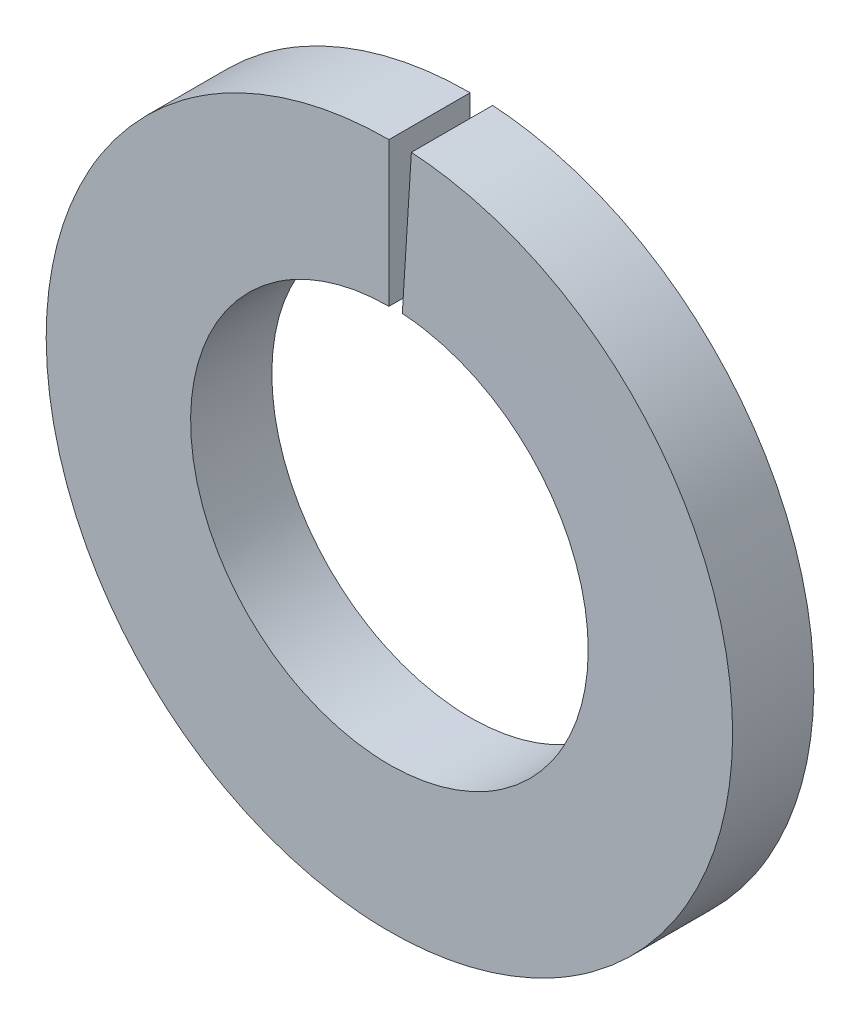
ISO-10303-21;
HEADER;
FILE_DESCRIPTION(('STEP AP214'),'2;1');
FILE_NAME('part.step','',(''),(''),'','','');
FILE_SCHEMA(('AUTOMOTIVE_DESIGN { 1 0 10303 214 1 1 1 1 }'));
ENDSEC;
DATA;
#1=APPLICATION_CONTEXT('core data for automotive mechanical design processes');
#2=APPLICATION_PROTOCOL_DEFINITION('international standard','automotive_design',2000,#1);
#3=PRODUCT_CONTEXT('',#1,'mechanical');
#4=PRODUCT('Part','Part','',(#3));
#5=PRODUCT_RELATED_PRODUCT_CATEGORY('part','',(#4));
#6=PRODUCT_DEFINITION_FORMATION('','',#4);
#7=PRODUCT_DEFINITION_CONTEXT('part definition',#1,'design');
#8=PRODUCT_DEFINITION('design','',#6,#7);
#9=PRODUCT_DEFINITION_SHAPE('','',#8);
#10=(LENGTH_UNIT() NAMED_UNIT(*) SI_UNIT(.MILLI.,.METRE.));
#11=(NAMED_UNIT(*) PLANE_ANGLE_UNIT() SI_UNIT($,.RADIAN.));
#12=(NAMED_UNIT(*) SI_UNIT($,.STERADIAN.) SOLID_ANGLE_UNIT());
#13=UNCERTAINTY_MEASURE_WITH_UNIT(LENGTH_MEASURE(1.E-05),#10,'distance_accuracy_value','');
#14=(GEOMETRIC_REPRESENTATION_CONTEXT(3) GLOBAL_UNCERTAINTY_ASSIGNED_CONTEXT((#13)) GLOBAL_UNIT_ASSIGNED_CONTEXT((#10,
#11,#12)) REPRESENTATION_CONTEXT('',''));
#15=CARTESIAN_POINT('',(0.,0.,0.));
#16=DIRECTION('',(0.,0.,1.));
#17=DIRECTION('',(1.,0.,0.));
#18=AXIS2_PLACEMENT_3D('',#15,#16,#17);
#19=CARTESIAN_POINT('',(0.,0.,0.));
#20=DIRECTION('',(1.,0.,0.));
#21=DIRECTION('',(0.,0.,-1.));
#22=AXIS2_PLACEMENT_3D('',#19,#20,#21);
#23=PLANE('',#22);
#24=DIRECTION('',(0.,0.,1.));
#25=VECTOR('',#24,1.);
#26=CARTESIAN_POINT('',(0.,3.8,0.));
#27=LINE('',#26,#25);
#28=CARTESIAN_POINT('',(0.,3.8,0.));
#29=VERTEX_POINT('',#28);
#30=CARTESIAN_POINT('',(0.,3.8,0.9));
#31=VERTEX_POINT('',#30);
#32=EDGE_CURVE('E88',#29,#31,#27,.T.);
#33=ORIENTED_EDGE('',*,*,#32,.T.);
#34=DIRECTION('',(0.,-1.,0.));
#35=VECTOR('',#34,1.);
#36=CARTESIAN_POINT('',(0.,3.8,0.9));
#37=LINE('',#36,#35);
#38=CARTESIAN_POINT('',(0.,2.2,0.9));
#39=VERTEX_POINT('',#38);
#40=EDGE_CURVE('E81',#31,#39,#37,.T.);
#41=ORIENTED_EDGE('',*,*,#40,.T.);
#42=DIRECTION('',(0.,0.,-1.));
#43=VECTOR('',#42,1.);
#44=CARTESIAN_POINT('',(0.,2.2,0.));
#45=LINE('',#44,#43);
#46=CARTESIAN_POINT('',(0.,2.2,0.));
#47=VERTEX_POINT('',#46);
#48=EDGE_CURVE('E76',#39,#47,#45,.T.);
#49=ORIENTED_EDGE('',*,*,#48,.T.);
#50=DIRECTION('',(0.,1.,0.));
#51=VECTOR('',#50,1.);
#52=CARTESIAN_POINT('',(0.,3.8,0.));
#53=LINE('',#52,#51);
#54=EDGE_CURVE('E71',#47,#29,#53,.T.);
#55=ORIENTED_EDGE('',*,*,#54,.T.);
#56=EDGE_LOOP('',(#33,#41,#49,#55));
#57=FACE_BOUND('',#56,.T.);
#58=ADVANCED_FACE('F36',(#57),#23,.T.);
#59=CARTESIAN_POINT('',(0.,0.,-0.01));
#60=DIRECTION('',(0.998026728428272,-0.0627905195292991,0.));
#61=DIRECTION('',(0.,0.,-1.));
#62=AXIS2_PLACEMENT_3D('',#59,#60,#61);
#63=PLANE('',#62);
#64=DIRECTION('',(0.,0.,1.));
#65=VECTOR('',#64,1.);
#66=CARTESIAN_POINT('',(0.238603974211337,3.79250156802744,-0.01));
#67=LINE('',#66,#65);
#68=CARTESIAN_POINT('',(0.238603974211337,3.79250156802744,-0.01));
#69=VERTEX_POINT('',#68);
#70=CARTESIAN_POINT('',(0.238603974211306,3.79250156802744,0.89));
#71=VERTEX_POINT('',#70);
#72=EDGE_CURVE('E96',#69,#71,#67,.T.);
#73=ORIENTED_EDGE('',*,*,#72,.F.);
#74=DIRECTION('',(0.0627905195292991,0.998026728428272,0.));
#75=VECTOR('',#74,1.);
#76=CARTESIAN_POINT('',(0.238603974211337,3.79250156802744,-0.01));
#77=LINE('',#76,#75);
#78=CARTESIAN_POINT('',(0.138139142964458,2.1956588025422,-0.01));
#79=VERTEX_POINT('',#78);
#80=EDGE_CURVE('E11',#79,#69,#77,.T.);
#81=ORIENTED_EDGE('',*,*,#80,.F.);
#82=DIRECTION('',(0.,0.,-1.));
#83=VECTOR('',#82,1.);
#84=CARTESIAN_POINT('',(0.138139142964458,2.1956588025422,-0.01));
#85=LINE('',#84,#83);
#86=CARTESIAN_POINT('',(0.13813914296444,2.1956588025422,0.89));
#87=VERTEX_POINT('',#86);
#88=EDGE_CURVE('E50',#87,#79,#85,.T.);
#89=ORIENTED_EDGE('',*,*,#88,.F.);
#90=DIRECTION('',(-0.0627905195292991,-0.998026728428272,0.));
#91=VECTOR('',#90,1.);
#92=CARTESIAN_POINT('',(0.238603974211337,3.79250156802744,0.89));
#93=LINE('',#92,#91);
#94=EDGE_CURVE('E59',#71,#87,#93,.T.);
#95=ORIENTED_EDGE('',*,*,#94,.F.);
#96=EDGE_LOOP('',(#73,#81,#89,#95));
#97=FACE_BOUND('',#96,.T.);
#98=ADVANCED_FACE('F142',(#97),#63,.F.);
#99=CARTESIAN_POINT('',(0.,0.,0.));
#100=DIRECTION('',(0.,0.,-1.));
#101=DIRECTION('',(-1.,0.,0.));
#102=AXIS2_PLACEMENT_3D('',#99,#100,#101);
#103=CYLINDRICAL_SURFACE('',#102,3.8);
#104=CARTESIAN_POINT('',(0.,3.8,0.9));
#105=CARTESIAN_POINT('',(-2.16748173275853,3.8,0.899166666666666));
#106=CARTESIAN_POINT('',(-3.270819702615,1.9343573798514,0.898333333333333));
#107=CARTESIAN_POINT('',(-4.37415767247146,0.0687147597027889,0.8975));
#108=CARTESIAN_POINT('',(-3.32996538416666,-1.83066396158655,0.896666666666666));
#109=CARTESIAN_POINT('',(-2.28577309586187,-3.73004268287589,0.895833333333333));
#110=CARTESIAN_POINT('',(-0.11936088449683,-3.79812492938978,0.895));
#111=CARTESIAN_POINT('',(2.04705132686821,-3.86620717590367,0.894166666666666));
#112=CARTESIAN_POINT('',(3.2084461169077,-2.03614182092012,0.893333333333333));
#113=CARTESIAN_POINT('',(4.36984090694719,-0.206076465936575,0.8925));
#114=CARTESIAN_POINT('',(3.38582479191576,1.72516389901036,0.891666666666666));
#115=CARTESIAN_POINT('',(2.40180867688432,3.6564042639573,0.890833333333333));
#116=CARTESIAN_POINT('',(0.238603974211276,3.79250156802744,0.89));
#117=(BOUNDED_CURVE() B_SPLINE_CURVE(2,(#104,#105,#106,#107,#108,#109,#110,#111,#112,#113,#114,
#115,#116),.UNSPECIFIED.,.F.,.F.) B_SPLINE_CURVE_WITH_KNOTS((3,2,2,2,2,2,3),(0.,
0.166666666666667,0.333333333333333,0.5,0.666666666666667,0.833333333333333,1.),
.UNSPECIFIED.) CURVE() GEOMETRIC_REPRESENTATION_ITEM() RATIONAL_B_SPLINE_CURVE((1.,
0.86863151443819,1.,0.86863151443819,1.,0.86863151443819,1.,0.86863151443819,1.,
0.86863151443819,1.,0.86863151443819,1.)) REPRESENTATION_ITEM(''));
#118=EDGE_CURVE('E91',#31,#71,#117,.T.);
#119=ORIENTED_EDGE('',*,*,#118,.F.);
#120=ORIENTED_EDGE('',*,*,#32,.F.);
#121=CARTESIAN_POINT('',(0.,3.8,0.));
#122=CARTESIAN_POINT('',(-2.16748173275853,3.8,-0.000833333333333333));
#123=CARTESIAN_POINT('',(-3.27081970261499,1.9343573798514,-0.00166666666666667));
#124=CARTESIAN_POINT('',(-4.37415767247146,0.0687147597028063,-0.0025));
#125=CARTESIAN_POINT('',(-3.32996538416667,-1.83066396158653,-0.00333333333333333));
#126=CARTESIAN_POINT('',(-2.28577309586189,-3.73004268287588,-0.00416666666666667));
#127=CARTESIAN_POINT('',(-0.11936088449686,-3.79812492938978,-0.005));
#128=CARTESIAN_POINT('',(2.04705132686817,-3.86620717590369,-0.00583333333333333));
#129=CARTESIAN_POINT('',(3.20844611690768,-2.03614182092016,-0.00666666666666667));
#130=CARTESIAN_POINT('',(4.36984090694718,-0.206076465936626,-0.0075));
#131=CARTESIAN_POINT('',(3.38582479191578,1.72516389901032,-0.00833333333333333));
#132=CARTESIAN_POINT('',(2.40180867688437,3.65640426395726,-0.00916666666666667));
#133=CARTESIAN_POINT('',(0.238603974211337,3.79250156802744,-0.01));
#134=(BOUNDED_CURVE() B_SPLINE_CURVE(2,(#121,#122,#123,#124,#125,#126,#127,#128,#129,#130,#131,
#132,#133),.UNSPECIFIED.,.F.,.F.) B_SPLINE_CURVE_WITH_KNOTS((3,2,2,2,2,2,3),(0.,
0.166666666666667,0.333333333333333,0.5,0.666666666666667,0.833333333333333,1.),
.UNSPECIFIED.) CURVE() GEOMETRIC_REPRESENTATION_ITEM() RATIONAL_B_SPLINE_CURVE((1.,
0.868631514438191,1.,0.868631514438191,1.,0.868631514438191,1.,0.868631514438191,1.,
0.868631514438191,1.,0.868631514438191,1.)) REPRESENTATION_ITEM(''));
#135=EDGE_CURVE('E90',#29,#69,#134,.T.);
#136=ORIENTED_EDGE('',*,*,#135,.T.);
#137=ORIENTED_EDGE('',*,*,#72,.T.);
#138=EDGE_LOOP('',(#119,#120,#136,#137));
#139=FACE_BOUND('',#138,.T.);
#140=ADVANCED_FACE('F89',(#139),#103,.T.);
#141=CARTESIAN_POINT('',(0.,3.8,0.9));
#142=CARTESIAN_POINT('',(-2.16748173275853,3.8,0.899166666666666));
#143=CARTESIAN_POINT('',(-3.270819702615,1.9343573798514,0.898333333333333));
#144=CARTESIAN_POINT('',(-4.37415767247146,0.0687147597027889,0.8975));
#145=CARTESIAN_POINT('',(-3.32996538416666,-1.83066396158655,0.896666666666666));
#146=CARTESIAN_POINT('',(-2.28577309586187,-3.73004268287589,0.895833333333333));
#147=CARTESIAN_POINT('',(-0.11936088449683,-3.79812492938978,0.895));
#148=CARTESIAN_POINT('',(2.04705132686821,-3.86620717590367,0.894166666666666));
#149=CARTESIAN_POINT('',(3.2084461169077,-2.03614182092012,0.893333333333333));
#150=CARTESIAN_POINT('',(4.36984090694719,-0.206076465936575,0.8925));
#151=CARTESIAN_POINT('',(3.38582479191576,1.72516389901036,0.891666666666666));
#152=CARTESIAN_POINT('',(2.40180867688432,3.6564042639573,0.890833333333333));
#153=CARTESIAN_POINT('',(0.238603974211276,3.79250156802744,0.89));
#154=CARTESIAN_POINT('',(0.,2.2,0.9));
#155=CARTESIAN_POINT('',(-1.25485784528126,2.2,0.899166666666666));
#156=CARTESIAN_POINT('',(-1.89363245940868,1.11989111465081,0.898333333333333));
#157=CARTESIAN_POINT('',(-2.53240707353611,0.0397822293016146,0.8975));
#158=CARTESIAN_POINT('',(-1.92787469609649,-1.05985808302379,0.896666666666666));
#159=CARTESIAN_POINT('',(-1.32334231865687,-2.1594983953492,0.895833333333333));
#160=CARTESIAN_POINT('',(-0.0691036699718489,-2.19891443280461,0.895));
#161=CARTESIAN_POINT('',(1.18513497871317,-2.23833047026002,0.894166666666666));
#162=CARTESIAN_POINT('',(1.85752143610446,-1.17881894895376,0.893333333333333));
#163=CARTESIAN_POINT('',(2.52990789349574,-0.119307427647491,0.8925));
#164=CARTESIAN_POINT('',(1.96021435321439,0.998779099427052,0.891666666666666));
#165=CARTESIAN_POINT('',(1.39052081293303,2.11686562650159,0.890833333333333));
#166=CARTESIAN_POINT('',(0.138139142964423,2.1956588025422,0.89));
#167=(BOUNDED_SURFACE() B_SPLINE_SURFACE(1,2,((#141,#142,#143,#144,#145,#146,#147,#148,#149,
#150,#151,#152,#153),(#154,#155,#156,#157,#158,#159,#160,#161,#162,#163,#164,#165,#166)),
.UNSPECIFIED.,.F.,.F.,.F.) B_SPLINE_SURFACE_WITH_KNOTS((2,2),(3,2,2,2,2,2,3),(0.,1.),(0.,
0.166666666666667,0.333333333333333,0.5,0.666666666666667,0.833333333333333,1.),
.UNSPECIFIED.) GEOMETRIC_REPRESENTATION_ITEM() RATIONAL_B_SPLINE_SURFACE(((1.,0.86863151443819,
1.,0.86863151443819,1.,0.86863151443819,1.,0.86863151443819,1.,0.86863151443819,1.,
0.86863151443819,1.),(1.,0.86863151443819,1.,0.86863151443819,1.,0.86863151443819,1.,
0.86863151443819,1.,0.86863151443819,1.,0.86863151443819,1.))) REPRESENTATION_ITEM('') SURFACE());
#168=CARTESIAN_POINT('',(0.,2.2,0.9));
#169=CARTESIAN_POINT('',(-1.25485784528126,2.2,0.899166666666666));
#170=CARTESIAN_POINT('',(-1.89363245940868,1.11989111465081,0.898333333333333));
#171=CARTESIAN_POINT('',(-2.53240707353611,0.0397822293016146,0.8975));
#172=CARTESIAN_POINT('',(-1.92787469609649,-1.05985808302379,0.896666666666666));
#173=CARTESIAN_POINT('',(-1.32334231865687,-2.1594983953492,0.895833333333333));
#174=CARTESIAN_POINT('',(-0.0691036699718489,-2.19891443280461,0.895));
#175=CARTESIAN_POINT('',(1.18513497871317,-2.23833047026002,0.894166666666666));
#176=CARTESIAN_POINT('',(1.85752143610446,-1.17881894895376,0.893333333333333));
#177=CARTESIAN_POINT('',(2.52990789349574,-0.119307427647491,0.8925));
#178=CARTESIAN_POINT('',(1.96021435321439,0.998779099427052,0.891666666666666));
#179=CARTESIAN_POINT('',(1.39052081293303,2.11686562650159,0.890833333333333));
#180=CARTESIAN_POINT('',(0.138139142964423,2.1956588025422,0.89));
#181=(BOUNDED_CURVE() B_SPLINE_CURVE(2,(#168,#169,#170,#171,#172,#173,#174,#175,#176,#177,#178,
#179,#180),.UNSPECIFIED.,.F.,.F.) B_SPLINE_CURVE_WITH_KNOTS((3,2,2,2,2,2,3),(0.,
0.166666666666667,0.333333333333333,0.5,0.666666666666667,0.833333333333333,1.),
.UNSPECIFIED.) CURVE() GEOMETRIC_REPRESENTATION_ITEM() RATIONAL_B_SPLINE_CURVE((1.,
0.86863151443819,1.,0.86863151443819,1.,0.86863151443819,1.,0.86863151443819,1.,
0.86863151443819,1.,0.86863151443819,1.)) REPRESENTATION_ITEM(''));
#182=EDGE_CURVE('E111',#39,#87,#181,.T.);
#183=ORIENTED_EDGE('',*,*,#182,.F.);
#184=ORIENTED_EDGE('',*,*,#40,.F.);
#185=ORIENTED_EDGE('',*,*,#118,.T.);
#186=ORIENTED_EDGE('',*,*,#94,.T.);
#187=EDGE_LOOP('',(#183,#184,#185,#186));
#188=FACE_BOUND('',#187,.T.);
#189=ADVANCED_FACE('F129',(#188),#167,.F.);
#190=CARTESIAN_POINT('',(0.,0.,0.));
#191=DIRECTION('',(0.,0.,-1.));
#192=DIRECTION('',(-1.,0.,0.));
#193=AXIS2_PLACEMENT_3D('',#190,#191,#192);
#194=CYLINDRICAL_SURFACE('',#193,2.2);
#195=CARTESIAN_POINT('',(0.,2.2,0.));
#196=CARTESIAN_POINT('',(-1.25485784528125,2.2,-0.000833333333333333));
#197=CARTESIAN_POINT('',(-1.89363245940868,1.11989111465081,-0.00166666666666667));
#198=CARTESIAN_POINT('',(-2.53240707353611,0.0397822293016247,-0.0025));
#199=CARTESIAN_POINT('',(-1.9278746960965,-1.05985808302378,-0.00333333333333333));
#200=CARTESIAN_POINT('',(-1.32334231865689,-2.15949839534919,-0.00416666666666667));
#201=CARTESIAN_POINT('',(-0.0691036699718665,-2.19891443280461,-0.005));
#202=CARTESIAN_POINT('',(1.18513497871315,-2.23833047026003,-0.00583333333333333));
#203=CARTESIAN_POINT('',(1.85752143610444,-1.17881894895378,-0.00666666666666667));
#204=CARTESIAN_POINT('',(2.52990789349574,-0.11930742764752,-0.0075));
#205=CARTESIAN_POINT('',(1.9602143532144,0.998779099427025,-0.00833333333333333));
#206=CARTESIAN_POINT('',(1.39052081293306,2.11686562650157,-0.00916666666666667));
#207=CARTESIAN_POINT('',(0.138139142964458,2.1956588025422,-0.01));
#208=(BOUNDED_CURVE() B_SPLINE_CURVE(2,(#195,#196,#197,#198,#199,#200,#201,#202,#203,#204,#205,
#206,#207),.UNSPECIFIED.,.F.,.F.) B_SPLINE_CURVE_WITH_KNOTS((3,2,2,2,2,2,3),(0.,
0.166666666666667,0.333333333333333,0.5,0.666666666666667,0.833333333333333,1.),
.UNSPECIFIED.) CURVE() GEOMETRIC_REPRESENTATION_ITEM() RATIONAL_B_SPLINE_CURVE((1.,
0.868631514438191,1.,0.868631514438191,1.,0.868631514438191,1.,0.868631514438191,1.,
0.868631514438191,1.,0.868631514438191,1.)) REPRESENTATION_ITEM(''));
#209=EDGE_CURVE('E43',#47,#79,#208,.T.);
#210=ORIENTED_EDGE('',*,*,#209,.F.);
#211=ORIENTED_EDGE('',*,*,#48,.F.);
#212=ORIENTED_EDGE('',*,*,#182,.T.);
#213=ORIENTED_EDGE('',*,*,#88,.T.);
#214=EDGE_LOOP('',(#210,#211,#212,#213));
#215=FACE_BOUND('',#214,.T.);
#216=ADVANCED_FACE('F127',(#215),#194,.F.);
#217=CARTESIAN_POINT('',(0.,2.2,0.));
#218=CARTESIAN_POINT('',(-1.25485784528125,2.2,-0.000833333333333333));
#219=CARTESIAN_POINT('',(-1.89363245940868,1.11989111465081,-0.00166666666666667));
#220=CARTESIAN_POINT('',(-2.53240707353611,0.0397822293016247,-0.0025));
#221=CARTESIAN_POINT('',(-1.9278746960965,-1.05985808302378,-0.00333333333333333));
#222=CARTESIAN_POINT('',(-1.32334231865689,-2.15949839534919,-0.00416666666666667));
#223=CARTESIAN_POINT('',(-0.0691036699718665,-2.19891443280461,-0.005));
#224=CARTESIAN_POINT('',(1.18513497871315,-2.23833047026003,-0.00583333333333333));
#225=CARTESIAN_POINT('',(1.85752143610444,-1.17881894895378,-0.00666666666666667));
#226=CARTESIAN_POINT('',(2.52990789349574,-0.11930742764752,-0.0075));
#227=CARTESIAN_POINT('',(1.9602143532144,0.998779099427025,-0.00833333333333333));
#228=CARTESIAN_POINT('',(1.39052081293306,2.11686562650157,-0.00916666666666667));
#229=CARTESIAN_POINT('',(0.138139142964458,2.1956588025422,-0.01));
#230=CARTESIAN_POINT('',(0.,3.8,0.));
#231=CARTESIAN_POINT('',(-2.16748173275853,3.8,-0.000833333333333333));
#232=CARTESIAN_POINT('',(-3.27081970261499,1.9343573798514,-0.00166666666666667));
#233=CARTESIAN_POINT('',(-4.37415767247146,0.0687147597028063,-0.0025));
#234=CARTESIAN_POINT('',(-3.32996538416667,-1.83066396158653,-0.00333333333333333));
#235=CARTESIAN_POINT('',(-2.28577309586189,-3.73004268287588,-0.00416666666666667));
#236=CARTESIAN_POINT('',(-0.11936088449686,-3.79812492938978,-0.005));
#237=CARTESIAN_POINT('',(2.04705132686817,-3.86620717590369,-0.00583333333333333));
#238=CARTESIAN_POINT('',(3.20844611690768,-2.03614182092016,-0.00666666666666667));
#239=CARTESIAN_POINT('',(4.36984090694718,-0.206076465936626,-0.0075));
#240=CARTESIAN_POINT('',(3.38582479191578,1.72516389901032,-0.00833333333333333));
#241=CARTESIAN_POINT('',(2.40180867688437,3.65640426395726,-0.00916666666666667));
#242=CARTESIAN_POINT('',(0.238603974211337,3.79250156802744,-0.01));
#243=(BOUNDED_SURFACE() B_SPLINE_SURFACE(1,2,((#217,#218,#219,#220,#221,#222,#223,#224,#225,
#226,#227,#228,#229),(#230,#231,#232,#233,#234,#235,#236,#237,#238,#239,#240,#241,#242)),
.UNSPECIFIED.,.F.,.F.,.F.) B_SPLINE_SURFACE_WITH_KNOTS((2,2),(3,2,2,2,2,2,3),(0.,1.),(0.,
0.166666666666667,0.333333333333333,0.5,0.666666666666667,0.833333333333333,1.),
.UNSPECIFIED.) GEOMETRIC_REPRESENTATION_ITEM() RATIONAL_B_SPLINE_SURFACE(((1.,0.868631514438191,
1.,0.868631514438191,1.,0.868631514438191,1.,0.868631514438191,1.,0.868631514438191,1.,
0.868631514438191,1.),(1.,0.868631514438191,1.,0.868631514438191,1.,0.868631514438191,1.,
0.868631514438191,1.,0.868631514438191,1.,0.868631514438191,1.))) REPRESENTATION_ITEM('') SURFACE());
#244=ORIENTED_EDGE('',*,*,#80,.T.);
#245=ORIENTED_EDGE('',*,*,#135,.F.);
#246=ORIENTED_EDGE('',*,*,#54,.F.);
#247=ORIENTED_EDGE('',*,*,#209,.T.);
#248=EDGE_LOOP('',(#244,#245,#246,#247));
#249=FACE_BOUND('',#248,.T.);
#250=ADVANCED_FACE('F94',(#249),#243,.F.);
#251=CLOSED_SHELL('',(#58,#98,#140,#189,#216,#250));
#252=MANIFOLD_SOLID_BREP('B2',#251);
#253=ADVANCED_BREP_SHAPE_REPRESENTATION('',(#18,#252),#14);
#254=SHAPE_DEFINITION_REPRESENTATION(#9,#253);
ENDSEC;
END-ISO-10303-21;
